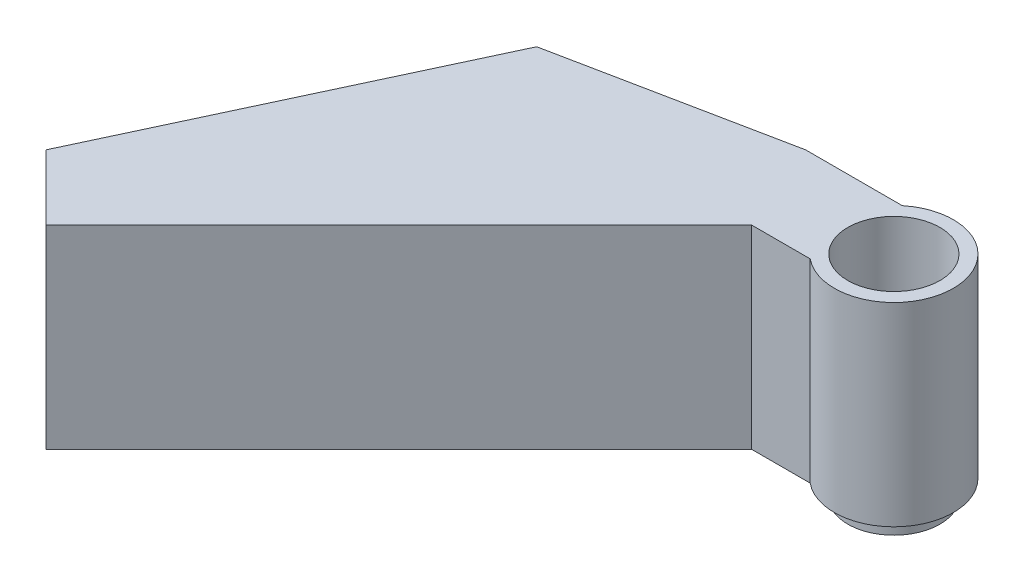
ISO-10303-21;
HEADER;
FILE_DESCRIPTION(('STEP AP214'),'2;1');
FILE_NAME('part.step','',(''),(''),'','','');
FILE_SCHEMA(('AUTOMOTIVE_DESIGN { 1 0 10303 214 1 1 1 1 }'));
ENDSEC;
DATA;
#1=APPLICATION_CONTEXT('core data for automotive mechanical design processes');
#2=APPLICATION_PROTOCOL_DEFINITION('international standard','automotive_design',2000,#1);
#3=PRODUCT_CONTEXT('',#1,'mechanical');
#4=PRODUCT('Part','Part','',(#3));
#5=PRODUCT_RELATED_PRODUCT_CATEGORY('part','',(#4));
#6=PRODUCT_DEFINITION_FORMATION('','',#4);
#7=PRODUCT_DEFINITION_CONTEXT('part definition',#1,'design');
#8=PRODUCT_DEFINITION('design','',#6,#7);
#9=PRODUCT_DEFINITION_SHAPE('','',#8);
#10=(LENGTH_UNIT() NAMED_UNIT(*) SI_UNIT(.MILLI.,.METRE.));
#11=(NAMED_UNIT(*) PLANE_ANGLE_UNIT() SI_UNIT($,.RADIAN.));
#12=(NAMED_UNIT(*) SI_UNIT($,.STERADIAN.) SOLID_ANGLE_UNIT());
#13=UNCERTAINTY_MEASURE_WITH_UNIT(LENGTH_MEASURE(1.E-05),#10,'distance_accuracy_value','');
#14=(GEOMETRIC_REPRESENTATION_CONTEXT(3) GLOBAL_UNCERTAINTY_ASSIGNED_CONTEXT((#13)) GLOBAL_UNIT_ASSIGNED_CONTEXT((#10,
#11,#12)) REPRESENTATION_CONTEXT('',''));
#15=CARTESIAN_POINT('',(0.,0.,0.));
#16=DIRECTION('',(0.,0.,1.));
#17=DIRECTION('',(1.,0.,0.));
#18=AXIS2_PLACEMENT_3D('',#15,#16,#17);
#19=CARTESIAN_POINT('',(0.,4.715,0.));
#20=DIRECTION('',(0.,-1.,0.));
#21=DIRECTION('',(0.,0.,-1.));
#22=AXIS2_PLACEMENT_3D('',#19,#20,#21);
#23=CYLINDRICAL_SURFACE('',#22,3.43);
#24=CARTESIAN_POINT('',(0.,0.,0.));
#25=DIRECTION('',(0.,1.,0.));
#26=DIRECTION('',(0.,0.,1.));
#27=AXIS2_PLACEMENT_3D('',#24,#25,#26);
#28=CIRCLE('',#27,3.43);
#29=CARTESIAN_POINT('',(0.,0.,-3.43));
#30=VERTEX_POINT('',#29);
#31=EDGE_CURVE('E58',#30,#30,#28,.T.);
#32=CARTESIAN_POINT('',(0.,1.25,0.));
#33=DIRECTION('',(0.,1.,0.));
#34=DIRECTION('',(0.,0.,1.));
#35=AXIS2_PLACEMENT_3D('',#32,#33,#34);
#36=CIRCLE('',#35,3.43);
#37=CARTESIAN_POINT('',(0.,1.25,-3.43));
#38=VERTEX_POINT('',#37);
#39=EDGE_CURVE('E182',#38,#38,#36,.F.);
#40=CARTESIAN_POINT('',(0.,0.,-3.43));
#41=CARTESIAN_POINT('',(0.,0.0130208333333333,-3.43));
#42=CARTESIAN_POINT('',(0.,0.0260416666666667,-3.43));
#43=CARTESIAN_POINT('',(0.,0.0520833333333334,-3.43));
#44=CARTESIAN_POINT('',(0.,0.0651041666666667,-3.43));
#45=CARTESIAN_POINT('',(0.,0.0911458333333334,-3.43));
#46=CARTESIAN_POINT('',(0.,0.104166666666667,-3.43));
#47=CARTESIAN_POINT('',(0.,0.130208333333333,-3.43));
#48=CARTESIAN_POINT('',(0.,0.143229166666667,-3.43));
#49=CARTESIAN_POINT('',(0.,0.169270833333333,-3.43));
#50=CARTESIAN_POINT('',(0.,0.182291666666667,-3.43));
#51=CARTESIAN_POINT('',(0.,0.208333333333334,-3.43));
#52=CARTESIAN_POINT('',(0.,0.221354166666667,-3.43));
#53=CARTESIAN_POINT('',(0.,0.247395833333334,-3.43));
#54=CARTESIAN_POINT('',(0.,0.260416666666667,-3.43));
#55=CARTESIAN_POINT('',(0.,0.286458333333334,-3.43));
#56=CARTESIAN_POINT('',(0.,0.299479166666667,-3.43));
#57=CARTESIAN_POINT('',(0.,0.325520833333333,-3.43));
#58=CARTESIAN_POINT('',(0.,0.338541666666666,-3.43));
#59=CARTESIAN_POINT('',(0.,0.364583333333333,-3.43));
#60=CARTESIAN_POINT('',(0.,0.377604166666666,-3.43));
#61=CARTESIAN_POINT('',(0.,0.403645833333333,-3.43));
#62=CARTESIAN_POINT('',(0.,0.416666666666666,-3.43));
#63=CARTESIAN_POINT('',(0.,0.442708333333333,-3.43));
#64=CARTESIAN_POINT('',(0.,0.455729166666666,-3.43));
#65=CARTESIAN_POINT('',(0.,0.481770833333333,-3.43));
#66=CARTESIAN_POINT('',(0.,0.494791666666666,-3.43));
#67=CARTESIAN_POINT('',(0.,0.520833333333333,-3.43));
#68=CARTESIAN_POINT('',(0.,0.533854166666666,-3.43));
#69=CARTESIAN_POINT('',(0.,0.559895833333333,-3.43));
#70=CARTESIAN_POINT('',(0.,0.572916666666666,-3.43));
#71=CARTESIAN_POINT('',(0.,0.598958333333333,-3.43));
#72=CARTESIAN_POINT('',(0.,0.611979166666666,-3.43));
#73=CARTESIAN_POINT('',(0.,0.638020833333333,-3.43));
#74=CARTESIAN_POINT('',(0.,0.651041666666666,-3.43));
#75=CARTESIAN_POINT('',(0.,0.677083333333333,-3.43));
#76=CARTESIAN_POINT('',(0.,0.690104166666666,-3.43));
#77=CARTESIAN_POINT('',(0.,0.716145833333333,-3.43));
#78=CARTESIAN_POINT('',(0.,0.729166666666667,-3.43));
#79=CARTESIAN_POINT('',(0.,0.755208333333333,-3.43));
#80=CARTESIAN_POINT('',(0.,0.768229166666667,-3.43));
#81=CARTESIAN_POINT('',(0.,0.794270833333333,-3.43));
#82=CARTESIAN_POINT('',(0.,0.807291666666666,-3.43));
#83=CARTESIAN_POINT('',(0.,0.833333333333333,-3.43));
#84=CARTESIAN_POINT('',(0.,0.846354166666666,-3.43));
#85=CARTESIAN_POINT('',(0.,0.872395833333332,-3.43));
#86=CARTESIAN_POINT('',(0.,0.885416666666666,-3.43));
#87=CARTESIAN_POINT('',(0.,0.911458333333332,-3.43));
#88=CARTESIAN_POINT('',(0.,0.924479166666666,-3.43));
#89=CARTESIAN_POINT('',(0.,0.950520833333332,-3.43));
#90=CARTESIAN_POINT('',(0.,0.963541666666666,-3.43));
#91=CARTESIAN_POINT('',(0.,0.989583333333333,-3.43));
#92=CARTESIAN_POINT('',(0.,1.00260416666667,-3.43));
#93=CARTESIAN_POINT('',(0.,1.02864583333333,-3.43));
#94=CARTESIAN_POINT('',(0.,1.04166666666667,-3.43));
#95=CARTESIAN_POINT('',(0.,1.06770833333333,-3.43));
#96=CARTESIAN_POINT('',(0.,1.08072916666667,-3.43));
#97=CARTESIAN_POINT('',(0.,1.10677083333333,-3.43));
#98=CARTESIAN_POINT('',(0.,1.11979166666667,-3.43));
#99=CARTESIAN_POINT('',(0.,1.14583333333333,-3.43));
#100=CARTESIAN_POINT('',(0.,1.15885416666667,-3.43));
#101=CARTESIAN_POINT('',(0.,1.18489583333333,-3.43));
#102=CARTESIAN_POINT('',(0.,1.19791666666667,-3.43));
#103=CARTESIAN_POINT('',(0.,1.22395833333333,-3.43));
#104=CARTESIAN_POINT('',(0.,1.23697916666667,-3.43));
#105=CARTESIAN_POINT('',(0.,1.25,-3.43));
#106=B_SPLINE_CURVE_WITH_KNOTS('',3,(#40,#41,#42,#43,#44,#45,#46,#47,#48,#49,#50,#51,#52,#53,
#54,#55,#56,#57,#58,#59,#60,#61,#62,#63,#64,#65,#66,#67,#68,#69,#70,#71,#72,#73,#74,#75,#76,#77,
#78,#79,#80,#81,#82,#83,#84,#85,#86,#87,#88,#89,#90,#91,#92,#93,#94,#95,#96,#97,#98,#99,#100,
#101,#102,#103,#104,#105),.UNSPECIFIED.,.F.,.F.,(4,2,2,2,2,2,2,2,2,2,2,2,2,2,2,2,2,2,2,2,2,2,2,
2,2,2,2,2,2,2,2,2,4),(0.,0.0390625,0.0781250000000001,0.1171875,0.15625,0.1953125,0.234375,
0.2734375,0.3125,0.351562499999999,0.390625,0.4296875,0.46875,0.5078125,0.546875,0.5859375,
0.625,0.6640625,0.703125,0.7421875,0.78125,0.820312499999999,0.859374999999999,
0.898437499999999,0.937499999999999,0.976562499999999,1.015625,1.0546875,1.09375,1.1328125,
1.171875,1.2109375,1.25),.UNSPECIFIED.);
#107=EDGE_CURVE('BSEAM49',#30,#38,#106,.T.);
#108=ORIENTED_EDGE('',*,*,#31,.T.);
#109=ORIENTED_EDGE('',*,*,#39,.T.);
#110=ORIENTED_EDGE('',*,*,#107,.T.);
#111=ORIENTED_EDGE('',*,*,#107,.F.);
#112=EDGE_LOOP('',(#108,#110,#109,#111));
#113=FACE_BOUND('',#112,.T.);
#114=ADVANCED_FACE('F49',(#113),#23,.T.);
#115=CARTESIAN_POINT('',(0.,4.715,0.));
#116=DIRECTION('',(0.,-1.,0.));
#117=DIRECTION('',(0.,0.,-1.));
#118=AXIS2_PLACEMENT_3D('',#115,#116,#117);
#119=CYLINDRICAL_SURFACE('',#118,1.235);
#120=CARTESIAN_POINT('',(0.,3.85,0.));
#121=DIRECTION('',(0.,1.,0.));
#122=DIRECTION('',(0.,0.,1.));
#123=AXIS2_PLACEMENT_3D('',#120,#121,#122);
#124=CIRCLE('',#123,1.235);
#125=CARTESIAN_POINT('',(0.,3.85,-1.235));
#126=VERTEX_POINT('',#125);
#127=EDGE_CURVE('E204',#126,#126,#124,.T.);
#128=CARTESIAN_POINT('',(0.,2.8,0.));
#129=DIRECTION('',(0.,-1.,0.));
#130=DIRECTION('',(0.,0.,-1.));
#131=AXIS2_PLACEMENT_3D('',#128,#129,#130);
#132=CIRCLE('',#131,1.235);
#133=CARTESIAN_POINT('',(0.,2.8,-1.235));
#134=VERTEX_POINT('',#133);
#135=EDGE_CURVE('E52',#134,#134,#132,.T.);
#136=CARTESIAN_POINT('',(0.,3.85,-1.235));
#137=CARTESIAN_POINT('',(0.,3.8390625,-1.235));
#138=CARTESIAN_POINT('',(0.,3.828125,-1.235));
#139=CARTESIAN_POINT('',(0.,3.80625,-1.235));
#140=CARTESIAN_POINT('',(0.,3.7953125,-1.235));
#141=CARTESIAN_POINT('',(0.,3.7734375,-1.235));
#142=CARTESIAN_POINT('',(0.,3.7625,-1.235));
#143=CARTESIAN_POINT('',(0.,3.740625,-1.235));
#144=CARTESIAN_POINT('',(0.,3.7296875,-1.235));
#145=CARTESIAN_POINT('',(0.,3.7078125,-1.235));
#146=CARTESIAN_POINT('',(0.,3.696875,-1.235));
#147=CARTESIAN_POINT('',(0.,3.675,-1.235));
#148=CARTESIAN_POINT('',(0.,3.6640625,-1.235));
#149=CARTESIAN_POINT('',(0.,3.6421875,-1.235));
#150=CARTESIAN_POINT('',(0.,3.63125,-1.235));
#151=CARTESIAN_POINT('',(0.,3.609375,-1.235));
#152=CARTESIAN_POINT('',(0.,3.5984375,-1.235));
#153=CARTESIAN_POINT('',(0.,3.5765625,-1.235));
#154=CARTESIAN_POINT('',(0.,3.565625,-1.235));
#155=CARTESIAN_POINT('',(0.,3.54375,-1.235));
#156=CARTESIAN_POINT('',(0.,3.5328125,-1.235));
#157=CARTESIAN_POINT('',(0.,3.5109375,-1.235));
#158=CARTESIAN_POINT('',(0.,3.5,-1.235));
#159=CARTESIAN_POINT('',(0.,3.478125,-1.235));
#160=CARTESIAN_POINT('',(0.,3.4671875,-1.235));
#161=CARTESIAN_POINT('',(0.,3.4453125,-1.235));
#162=CARTESIAN_POINT('',(0.,3.434375,-1.235));
#163=CARTESIAN_POINT('',(0.,3.4125,-1.235));
#164=CARTESIAN_POINT('',(0.,3.4015625,-1.235));
#165=CARTESIAN_POINT('',(0.,3.3796875,-1.235));
#166=CARTESIAN_POINT('',(0.,3.36875,-1.235));
#167=CARTESIAN_POINT('',(0.,3.346875,-1.235));
#168=CARTESIAN_POINT('',(0.,3.3359375,-1.235));
#169=CARTESIAN_POINT('',(0.,3.3140625,-1.235));
#170=CARTESIAN_POINT('',(0.,3.303125,-1.235));
#171=CARTESIAN_POINT('',(0.,3.28125,-1.235));
#172=CARTESIAN_POINT('',(0.,3.2703125,-1.235));
#173=CARTESIAN_POINT('',(0.,3.2484375,-1.235));
#174=CARTESIAN_POINT('',(0.,3.2375,-1.235));
#175=CARTESIAN_POINT('',(0.,3.215625,-1.235));
#176=CARTESIAN_POINT('',(0.,3.2046875,-1.235));
#177=CARTESIAN_POINT('',(0.,3.1828125,-1.235));
#178=CARTESIAN_POINT('',(0.,3.171875,-1.235));
#179=CARTESIAN_POINT('',(0.,3.15,-1.235));
#180=CARTESIAN_POINT('',(0.,3.1390625,-1.235));
#181=CARTESIAN_POINT('',(0.,3.1171875,-1.235));
#182=CARTESIAN_POINT('',(0.,3.10625,-1.235));
#183=CARTESIAN_POINT('',(0.,3.084375,-1.235));
#184=CARTESIAN_POINT('',(0.,3.0734375,-1.235));
#185=CARTESIAN_POINT('',(0.,3.0515625,-1.235));
#186=CARTESIAN_POINT('',(0.,3.040625,-1.235));
#187=CARTESIAN_POINT('',(0.,3.01875,-1.235));
#188=CARTESIAN_POINT('',(0.,3.0078125,-1.235));
#189=CARTESIAN_POINT('',(0.,2.9859375,-1.235));
#190=CARTESIAN_POINT('',(0.,2.975,-1.235));
#191=CARTESIAN_POINT('',(0.,2.953125,-1.235));
#192=CARTESIAN_POINT('',(0.,2.9421875,-1.235));
#193=CARTESIAN_POINT('',(0.,2.9203125,-1.235));
#194=CARTESIAN_POINT('',(0.,2.909375,-1.235));
#195=CARTESIAN_POINT('',(0.,2.8875,-1.235));
#196=CARTESIAN_POINT('',(0.,2.8765625,-1.235));
#197=CARTESIAN_POINT('',(0.,2.8546875,-1.235));
#198=CARTESIAN_POINT('',(0.,2.84375,-1.235));
#199=CARTESIAN_POINT('',(0.,2.821875,-1.235));
#200=CARTESIAN_POINT('',(0.,2.8109375,-1.235));
#201=CARTESIAN_POINT('',(0.,2.8,-1.235));
#202=B_SPLINE_CURVE_WITH_KNOTS('',3,(#136,#137,#138,#139,#140,#141,#142,#143,#144,#145,#146,
#147,#148,#149,#150,#151,#152,#153,#154,#155,#156,#157,#158,#159,#160,#161,#162,#163,#164,#165,
#166,#167,#168,#169,#170,#171,#172,#173,#174,#175,#176,#177,#178,#179,#180,#181,#182,#183,#184,
#185,#186,#187,#188,#189,#190,#191,#192,#193,#194,#195,#196,#197,#198,#199,#200,#201),
.UNSPECIFIED.,.F.,.F.,(4,2,2,2,2,2,2,2,2,2,2,2,2,2,2,2,2,2,2,2,2,2,2,2,2,2,2,2,2,2,2,2,4),(0.,
0.0328125000000003,0.0656250000000001,0.0984375,0.13125,0.1640625,0.196875,0.2296875,0.2625,
0.2953125,0.328125,0.3609375,0.39375,0.4265625,0.459375,0.4921875,0.525,0.5578125,0.590625,
0.623437499999999,0.65625,0.6890625,0.721875,0.7546875,0.7875,0.820312499999999,
0.853124999999999,0.8859375,0.91875,0.9515625,0.984375,1.0171875,1.05),.UNSPECIFIED.);
#203=EDGE_CURVE('BSEAM214',#126,#134,#202,.T.);
#204=ORIENTED_EDGE('',*,*,#127,.T.);
#205=ORIENTED_EDGE('',*,*,#135,.T.);
#206=ORIENTED_EDGE('',*,*,#203,.T.);
#207=ORIENTED_EDGE('',*,*,#203,.F.);
#208=EDGE_LOOP('',(#204,#206,#205,#207));
#209=FACE_BOUND('',#208,.T.);
#210=ADVANCED_FACE('F214',(#209),#119,.F.);
#211=CARTESIAN_POINT('',(0.,4.715,0.));
#212=DIRECTION('',(0.,1.,0.));
#213=DIRECTION('',(0.,0.,1.));
#214=AXIS2_PLACEMENT_3D('',#211,#212,#213);
#215=PLANE('',#214);
#216=CARTESIAN_POINT('',(0.,4.715,0.));
#217=DIRECTION('',(0.,1.,0.));
#218=DIRECTION('',(0.,0.,1.));
#219=AXIS2_PLACEMENT_3D('',#216,#217,#218);
#220=CIRCLE('',#219,2.45);
#221=CARTESIAN_POINT('',(0.,4.715,2.45));
#222=VERTEX_POINT('',#221);
#223=EDGE_CURVE('E191',#222,#222,#220,.T.);
#224=ORIENTED_EDGE('',*,*,#223,.F.);
#225=EDGE_LOOP('',(#224));
#226=FACE_BOUND('',#225,.T.);
#227=CARTESIAN_POINT('',(0.,4.715,0.));
#228=DIRECTION('',(0.,1.,0.));
#229=DIRECTION('',(0.,0.,1.));
#230=AXIS2_PLACEMENT_3D('',#227,#228,#229);
#231=CIRCLE('',#230,3.43);
#232=CARTESIAN_POINT('',(0.,4.715,3.43));
#233=VERTEX_POINT('',#232);
#234=EDGE_CURVE('E12',#233,#233,#231,.T.);
#235=ORIENTED_EDGE('',*,*,#234,.T.);
#236=EDGE_LOOP('',(#235));
#237=FACE_BOUND('',#236,.T.);
#238=ADVANCED_FACE('F231',(#226,#237),#215,.T.);
#239=CARTESIAN_POINT('',(0.,0.,0.));
#240=DIRECTION('',(0.,1.,0.));
#241=DIRECTION('',(0.,0.,1.));
#242=AXIS2_PLACEMENT_3D('',#239,#240,#241);
#243=PLANE('',#242);
#244=CARTESIAN_POINT('',(0.,0.,0.));
#245=DIRECTION('',(0.,-1.,0.));
#246=DIRECTION('',(0.,0.,-1.));
#247=AXIS2_PLACEMENT_3D('',#244,#245,#246);
#248=CIRCLE('',#247,2.5);
#249=CARTESIAN_POINT('',(0.,0.,-2.5));
#250=VERTEX_POINT('',#249);
#251=EDGE_CURVE('E171',#250,#250,#248,.T.);
#252=ORIENTED_EDGE('',*,*,#251,.F.);
#253=EDGE_LOOP('',(#252));
#254=FACE_BOUND('',#253,.T.);
#255=ORIENTED_EDGE('',*,*,#31,.F.);
#256=EDGE_LOOP('',(#255));
#257=FACE_BOUND('',#256,.T.);
#258=ADVANCED_FACE('F227',(#254,#257),#243,.F.);
#259=CARTESIAN_POINT('',(0.,3.85,0.));
#260=DIRECTION('',(0.,1.,0.));
#261=DIRECTION('',(0.,0.,1.));
#262=AXIS2_PLACEMENT_3D('',#259,#260,#261);
#263=CYLINDRICAL_SURFACE('',#262,2.45);
#264=CARTESIAN_POINT('',(0.,3.85,0.));
#265=DIRECTION('',(0.,1.,0.));
#266=DIRECTION('',(0.,0.,1.));
#267=AXIS2_PLACEMENT_3D('',#264,#265,#266);
#268=CIRCLE('',#267,2.45);
#269=CARTESIAN_POINT('',(0.,3.85,2.45));
#270=VERTEX_POINT('',#269);
#271=EDGE_CURVE('E200',#270,#270,#268,.T.);
#272=ORIENTED_EDGE('',*,*,#271,.F.);
#273=EDGE_LOOP('',(#272));
#274=FACE_BOUND('',#273,.T.);
#275=ORIENTED_EDGE('',*,*,#223,.T.);
#276=EDGE_LOOP('',(#275));
#277=FACE_BOUND('',#276,.T.);
#278=ADVANCED_FACE('F221',(#274,#277),#263,.F.);
#279=CARTESIAN_POINT('',(0.,3.85,0.));
#280=DIRECTION('',(0.,1.,0.));
#281=DIRECTION('',(0.,0.,1.));
#282=AXIS2_PLACEMENT_3D('',#279,#280,#281);
#283=PLANE('',#282);
#284=ORIENTED_EDGE('',*,*,#127,.F.);
#285=EDGE_LOOP('',(#284));
#286=FACE_BOUND('',#285,.T.);
#287=ORIENTED_EDGE('',*,*,#271,.T.);
#288=EDGE_LOOP('',(#287));
#289=FACE_BOUND('',#288,.T.);
#290=ADVANCED_FACE('F217',(#286,#289),#283,.T.);
#291=CARTESIAN_POINT('',(0.,-12.1268132664769,-3.43));
#292=DIRECTION('',(0.,0.,-1.));
#293=DIRECTION('',(-1.,0.,0.));
#294=AXIS2_PLACEMENT_3D('',#291,#292,#293);
#295=PLANE('',#294);
#296=DIRECTION('',(0.,1.,0.));
#297=VECTOR('',#296,1.);
#298=CARTESIAN_POINT('',(-2.80356915377524,-10.1878373262802,-3.43));
#299=LINE('',#298,#297);
#300=CARTESIAN_POINT('',(-2.80356915377524,1.25,-3.43));
#301=VERTEX_POINT('',#300);
#302=CARTESIAN_POINT('',(-2.80356915377524,15.715,-3.43));
#303=VERTEX_POINT('',#302);
#304=EDGE_CURVE('E143',#301,#303,#299,.T.);
#305=ORIENTED_EDGE('',*,*,#304,.F.);
#306=DIRECTION('',(1.,0.,0.));
#307=VECTOR('',#306,1.);
#308=CARTESIAN_POINT('',(0.,1.25,-3.43));
#309=LINE('',#308,#307);
#310=CARTESIAN_POINT('',(-10.,1.25,-3.43));
#311=VERTEX_POINT('',#310);
#312=EDGE_CURVE('E187',#311,#301,#309,.T.);
#313=ORIENTED_EDGE('',*,*,#312,.F.);
#314=DIRECTION('',(0.,-1.,0.));
#315=VECTOR('',#314,1.);
#316=CARTESIAN_POINT('',(-10.,15.715,-3.43));
#317=LINE('',#316,#315);
#318=CARTESIAN_POINT('',(-10.,15.715,-3.43));
#319=VERTEX_POINT('',#318);
#320=EDGE_CURVE('E168',#319,#311,#317,.T.);
#321=ORIENTED_EDGE('',*,*,#320,.F.);
#322=DIRECTION('',(-1.,0.,0.));
#323=VECTOR('',#322,1.);
#324=CARTESIAN_POINT('',(0.,15.715,-3.43));
#325=LINE('',#324,#323);
#326=EDGE_CURVE('E66',#303,#319,#325,.T.);
#327=ORIENTED_EDGE('',*,*,#326,.F.);
#328=EDGE_LOOP('',(#305,#313,#321,#327));
#329=FACE_BOUND('',#328,.T.);
#330=ADVANCED_FACE('F220',(#329),#295,.T.);
#331=CARTESIAN_POINT('',(0.,-12.1268132664769,0.));
#332=DIRECTION('',(0.,1.,0.));
#333=DIRECTION('',(0.,0.,1.));
#334=AXIS2_PLACEMENT_3D('',#331,#332,#333);
#335=CYLINDRICAL_SURFACE('',#334,3.43);
#336=CARTESIAN_POINT('',(0.,15.715,0.));
#337=DIRECTION('',(0.,1.,0.));
#338=DIRECTION('',(0.,0.,1.));
#339=AXIS2_PLACEMENT_3D('',#336,#337,#338);
#340=CIRCLE('',#339,3.43);
#341=CARTESIAN_POINT('',(0.,15.715,3.43));
#342=VERTEX_POINT('',#341);
#343=EDGE_CURVE('E183',#342,#342,#340,.T.);
#344=CARTESIAN_POINT('',(0.,15.715,3.43));
#345=CARTESIAN_POINT('',(0.,15.6004166666667,3.43));
#346=CARTESIAN_POINT('',(0.,15.4858333333333,3.43));
#347=CARTESIAN_POINT('',(0.,15.2566666666667,3.43));
#348=CARTESIAN_POINT('',(0.,15.1420833333333,3.43));
#349=CARTESIAN_POINT('',(0.,14.9129166666667,3.43));
#350=CARTESIAN_POINT('',(0.,14.7983333333333,3.43));
#351=CARTESIAN_POINT('',(0.,14.5691666666667,3.43));
#352=CARTESIAN_POINT('',(0.,14.4545833333333,3.43));
#353=CARTESIAN_POINT('',(0.,14.2254166666667,3.43));
#354=CARTESIAN_POINT('',(0.,14.1108333333333,3.43));
#355=CARTESIAN_POINT('',(0.,13.8816666666667,3.43));
#356=CARTESIAN_POINT('',(0.,13.7670833333333,3.43));
#357=CARTESIAN_POINT('',(0.,13.5379166666667,3.43));
#358=CARTESIAN_POINT('',(0.,13.4233333333333,3.43));
#359=CARTESIAN_POINT('',(0.,13.1941666666667,3.43));
#360=CARTESIAN_POINT('',(0.,13.0795833333333,3.43));
#361=CARTESIAN_POINT('',(0.,12.8504166666667,3.43));
#362=CARTESIAN_POINT('',(0.,12.7358333333333,3.43));
#363=CARTESIAN_POINT('',(0.,12.5066666666667,3.43));
#364=CARTESIAN_POINT('',(0.,12.3920833333333,3.43));
#365=CARTESIAN_POINT('',(0.,12.1629166666667,3.43));
#366=CARTESIAN_POINT('',(0.,12.0483333333333,3.43));
#367=CARTESIAN_POINT('',(0.,11.8191666666667,3.43));
#368=CARTESIAN_POINT('',(0.,11.7045833333333,3.43));
#369=CARTESIAN_POINT('',(0.,11.4754166666667,3.43));
#370=CARTESIAN_POINT('',(0.,11.3608333333333,3.43));
#371=CARTESIAN_POINT('',(0.,11.1316666666667,3.43));
#372=CARTESIAN_POINT('',(0.,11.0170833333333,3.43));
#373=CARTESIAN_POINT('',(0.,10.7879166666667,3.43));
#374=CARTESIAN_POINT('',(0.,10.6733333333333,3.43));
#375=CARTESIAN_POINT('',(0.,10.4441666666667,3.43));
#376=CARTESIAN_POINT('',(0.,10.3295833333333,3.43));
#377=CARTESIAN_POINT('',(0.,10.1004166666667,3.43));
#378=CARTESIAN_POINT('',(0.,9.98583333333333,3.43));
#379=CARTESIAN_POINT('',(0.,9.75666666666667,3.43));
#380=CARTESIAN_POINT('',(0.,9.64208333333333,3.43));
#381=CARTESIAN_POINT('',(0.,9.41291666666666,3.43));
#382=CARTESIAN_POINT('',(0.,9.29833333333333,3.43));
#383=CARTESIAN_POINT('',(0.,9.06916666666667,3.43));
#384=CARTESIAN_POINT('',(0.,8.95458333333333,3.43));
#385=CARTESIAN_POINT('',(0.,8.72541666666666,3.43));
#386=CARTESIAN_POINT('',(0.,8.61083333333333,3.43));
#387=CARTESIAN_POINT('',(0.,8.38166666666667,3.43));
#388=CARTESIAN_POINT('',(0.,8.26708333333333,3.43));
#389=CARTESIAN_POINT('',(0.,8.03791666666667,3.43));
#390=CARTESIAN_POINT('',(0.,7.92333333333333,3.43));
#391=CARTESIAN_POINT('',(0.,7.69416666666667,3.43));
#392=CARTESIAN_POINT('',(0.,7.57958333333333,3.43));
#393=CARTESIAN_POINT('',(0.,7.35041666666667,3.43));
#394=CARTESIAN_POINT('',(0.,7.23583333333333,3.43));
#395=CARTESIAN_POINT('',(0.,7.00666666666667,3.43));
#396=CARTESIAN_POINT('',(0.,6.89208333333333,3.43));
#397=CARTESIAN_POINT('',(0.,6.66291666666667,3.43));
#398=CARTESIAN_POINT('',(0.,6.54833333333333,3.43));
#399=CARTESIAN_POINT('',(0.,6.31916666666667,3.43));
#400=CARTESIAN_POINT('',(0.,6.20458333333333,3.43));
#401=CARTESIAN_POINT('',(0.,5.97541666666667,3.43));
#402=CARTESIAN_POINT('',(0.,5.86083333333333,3.43));
#403=CARTESIAN_POINT('',(0.,5.63166666666667,3.43));
#404=CARTESIAN_POINT('',(0.,5.51708333333333,3.43));
#405=CARTESIAN_POINT('',(0.,5.28791666666667,3.43));
#406=CARTESIAN_POINT('',(0.,5.17333333333333,3.43));
#407=CARTESIAN_POINT('',(0.,4.94416666666667,3.43));
#408=CARTESIAN_POINT('',(0.,4.82958333333333,3.43));
#409=CARTESIAN_POINT('',(0.,4.715,3.43));
#410=B_SPLINE_CURVE_WITH_KNOTS('',3,(#344,#345,#346,#347,#348,#349,#350,#351,#352,#353,#354,
#355,#356,#357,#358,#359,#360,#361,#362,#363,#364,#365,#366,#367,#368,#369,#370,#371,#372,#373,
#374,#375,#376,#377,#378,#379,#380,#381,#382,#383,#384,#385,#386,#387,#388,#389,#390,#391,#392,
#393,#394,#395,#396,#397,#398,#399,#400,#401,#402,#403,#404,#405,#406,#407,#408,#409),
.UNSPECIFIED.,.F.,.F.,(4,2,2,2,2,2,2,2,2,2,2,2,2,2,2,2,2,2,2,2,2,2,2,2,2,2,2,2,2,2,2,2,4),(0.,
0.34375,0.687500000000001,1.03125,1.375,1.71875,2.0625,2.40625,2.75,3.09375,3.4375,3.78125,
4.125,4.46875,4.8125,5.15625,5.5,5.84375,6.1875,6.53125,6.875,7.21875,7.5625,7.90625,8.25,
8.59375,8.9375,9.28125,9.62499999999999,9.96875,10.3125,10.65625,11.),.UNSPECIFIED.);
#411=EDGE_CURVE('BSEAM237',#342,#233,#410,.T.);
#412=ORIENTED_EDGE('',*,*,#343,.T.);
#413=ORIENTED_EDGE('',*,*,#234,.F.);
#414=ORIENTED_EDGE('',*,*,#411,.T.);
#415=ORIENTED_EDGE('',*,*,#411,.F.);
#416=EDGE_LOOP('',(#412,#414,#413,#415));
#417=FACE_BOUND('',#416,.T.);
#418=ADVANCED_FACE('F237',(#417),#335,.F.);
#419=CARTESIAN_POINT('',(0.,-12.1268132664769,3.43));
#420=DIRECTION('',(0.,0.,-1.));
#421=DIRECTION('',(-1.,0.,0.));
#422=AXIS2_PLACEMENT_3D('',#419,#420,#421);
#423=PLANE('',#422);
#424=DIRECTION('',(1.,0.,0.));
#425=VECTOR('',#424,1.);
#426=CARTESIAN_POINT('',(0.,1.25,3.43));
#427=LINE('',#426,#425);
#428=CARTESIAN_POINT('',(-7.15849496212056,1.25,3.43));
#429=VERTEX_POINT('',#428);
#430=CARTESIAN_POINT('',(-2.80356915377524,1.25,3.43));
#431=VERTEX_POINT('',#430);
#432=EDGE_CURVE('E179',#429,#431,#427,.T.);
#433=ORIENTED_EDGE('',*,*,#432,.T.);
#434=DIRECTION('',(0.,1.,0.));
#435=VECTOR('',#434,1.);
#436=CARTESIAN_POINT('',(-2.80356915377524,-10.1878373262802,3.43));
#437=LINE('',#436,#435);
#438=CARTESIAN_POINT('',(-2.80356915377524,15.715,3.43));
#439=VERTEX_POINT('',#438);
#440=EDGE_CURVE('E74',#431,#439,#437,.T.);
#441=ORIENTED_EDGE('',*,*,#440,.T.);
#442=DIRECTION('',(-1.,0.,0.));
#443=VECTOR('',#442,1.);
#444=CARTESIAN_POINT('',(0.,15.715,3.43));
#445=LINE('',#444,#443);
#446=CARTESIAN_POINT('',(-7.15849496212056,15.715,3.43));
#447=VERTEX_POINT('',#446);
#448=EDGE_CURVE('E194',#439,#447,#445,.T.);
#449=ORIENTED_EDGE('',*,*,#448,.T.);
#450=DIRECTION('',(0.,-1.,0.));
#451=VECTOR('',#450,1.);
#452=CARTESIAN_POINT('',(-7.15849496212056,-12.1268132664769,3.43));
#453=LINE('',#452,#451);
#454=EDGE_CURVE('E155',#447,#429,#453,.T.);
#455=ORIENTED_EDGE('',*,*,#454,.T.);
#456=EDGE_LOOP('',(#433,#441,#449,#455));
#457=FACE_BOUND('',#456,.T.);
#458=ADVANCED_FACE('F239',(#457),#423,.F.);
#459=CARTESIAN_POINT('',(0.,15.715,0.));
#460=DIRECTION('',(0.,1.,0.));
#461=DIRECTION('',(0.,0.,1.));
#462=AXIS2_PLACEMENT_3D('',#459,#460,#461);
#463=PLANE('',#462);
#464=DIRECTION('',(0.980224350285927,0.,-0.197889421411385));
#465=VECTOR('',#464,1.);
#466=CARTESIAN_POINT('',(-10.,15.715,-3.43));
#467=LINE('',#466,#465);
#468=CARTESIAN_POINT('',(-26.6638139548608,15.715,-0.0658798360064555));
#469=VERTEX_POINT('',#468);
#470=EDGE_CURVE('E113',#469,#319,#467,.T.);
#471=ORIENTED_EDGE('',*,*,#470,.F.);
#472=DIRECTION('',(-0.422618261740705,0.,0.906307787036647));
#473=VECTOR('',#472,1.);
#474=CARTESIAN_POINT('',(-38.2842712474618,15.715,24.854271247462));
#475=LINE('',#474,#473);
#476=CARTESIAN_POINT('',(-38.2842712474618,15.715,24.854271247462));
#477=VERTEX_POINT('',#476);
#478=EDGE_CURVE('E125',#469,#477,#475,.T.);
#479=ORIENTED_EDGE('',*,*,#478,.T.);
#480=DIRECTION('',(0.70710678118655,0.,0.707106781186546));
#481=VECTOR('',#480,1.);
#482=CARTESIAN_POINT('',(-38.2842712474618,15.715,24.854271247462));
#483=LINE('',#482,#481);
#484=CARTESIAN_POINT('',(-33.4335187285221,15.715,29.7050237664017));
#485=VERTEX_POINT('',#484);
#486=EDGE_CURVE('E140',#477,#485,#483,.T.);
#487=ORIENTED_EDGE('',*,*,#486,.T.);
#488=DIRECTION('',(0.707106781186546,0.,-0.707106781186549));
#489=VECTOR('',#488,1.);
#490=CARTESIAN_POINT('',(-33.4335187285221,15.715,29.7050237664017));
#491=LINE('',#490,#489);
#492=EDGE_CURVE('E158',#485,#447,#491,.T.);
#493=ORIENTED_EDGE('',*,*,#492,.T.);
#494=ORIENTED_EDGE('',*,*,#448,.F.);
#495=CARTESIAN_POINT('',(0.,15.715,0.));
#496=DIRECTION('',(0.,1.,0.));
#497=DIRECTION('',(0.,0.,1.));
#498=AXIS2_PLACEMENT_3D('',#495,#496,#497);
#499=CIRCLE('',#498,4.43);
#500=EDGE_CURVE('E441',#439,#303,#499,.T.);
#501=ORIENTED_EDGE('',*,*,#500,.T.);
#502=ORIENTED_EDGE('',*,*,#326,.T.);
#503=EDGE_LOOP('',(#471,#479,#487,#493,#494,#501,#502));
#504=FACE_BOUND('',#503,.T.);
#505=ORIENTED_EDGE('',*,*,#343,.F.);
#506=EDGE_LOOP('',(#505));
#507=FACE_BOUND('',#506,.T.);
#508=ADVANCED_FACE('F122',(#504,#507),#463,.T.);
#509=CARTESIAN_POINT('',(0.,1.25,0.));
#510=DIRECTION('',(0.,1.,0.));
#511=DIRECTION('',(0.,0.,1.));
#512=AXIS2_PLACEMENT_3D('',#509,#510,#511);
#513=PLANE('',#512);
#514=DIRECTION('',(0.422618261740705,0.,-0.906307787036647));
#515=VECTOR('',#514,1.);
#516=CARTESIAN_POINT('',(-38.2842712474618,1.25,24.854271247462));
#517=LINE('',#516,#515);
#518=CARTESIAN_POINT('',(-38.2842712474618,1.25,24.854271247462));
#519=VERTEX_POINT('',#518);
#520=CARTESIAN_POINT('',(-26.6638139548608,1.25,-0.0658798360064555));
#521=VERTEX_POINT('',#520);
#522=EDGE_CURVE('E135',#519,#521,#517,.T.);
#523=ORIENTED_EDGE('',*,*,#522,.T.);
#524=DIRECTION('',(0.980224350285927,0.,-0.197889421411385));
#525=VECTOR('',#524,1.);
#526=CARTESIAN_POINT('',(-1.05694001235814,1.25,-5.23544073005892));
#527=LINE('',#526,#525);
#528=EDGE_CURVE('E115',#521,#311,#527,.T.);
#529=ORIENTED_EDGE('',*,*,#528,.T.);
#530=ORIENTED_EDGE('',*,*,#312,.T.);
#531=CARTESIAN_POINT('',(0.,1.25,0.));
#532=DIRECTION('',(0.,1.,0.));
#533=DIRECTION('',(0.,0.,1.));
#534=AXIS2_PLACEMENT_3D('',#531,#532,#533);
#535=CIRCLE('',#534,4.43);
#536=EDGE_CURVE('E136',#301,#431,#535,.F.);
#537=ORIENTED_EDGE('',*,*,#536,.T.);
#538=ORIENTED_EDGE('',*,*,#432,.F.);
#539=DIRECTION('',(-0.707106781186546,0.,0.707106781186549));
#540=VECTOR('',#539,1.);
#541=CARTESIAN_POINT('',(-33.4335187285221,1.25,29.7050237664017));
#542=LINE('',#541,#540);
#543=CARTESIAN_POINT('',(-33.4335187285221,1.25,29.7050237664017));
#544=VERTEX_POINT('',#543);
#545=EDGE_CURVE('E151',#429,#544,#542,.T.);
#546=ORIENTED_EDGE('',*,*,#545,.T.);
#547=DIRECTION('',(-0.70710678118655,0.,-0.707106781186545));
#548=VECTOR('',#547,1.);
#549=CARTESIAN_POINT('',(-38.2842712474618,1.25,24.854271247462));
#550=LINE('',#549,#548);
#551=EDGE_CURVE('E147',#544,#519,#550,.T.);
#552=ORIENTED_EDGE('',*,*,#551,.T.);
#553=EDGE_LOOP('',(#523,#529,#530,#537,#538,#546,#552));
#554=FACE_BOUND('',#553,.T.);
#555=ORIENTED_EDGE('',*,*,#39,.F.);
#556=EDGE_LOOP('',(#555));
#557=FACE_BOUND('',#556,.T.);
#558=ADVANCED_FACE('F260',(#554,#557),#513,.F.);
#559=CARTESIAN_POINT('',(0.,2.8,0.));
#560=DIRECTION('',(0.,-1.,0.));
#561=DIRECTION('',(0.,0.,-1.));
#562=AXIS2_PLACEMENT_3D('',#559,#560,#561);
#563=CYLINDRICAL_SURFACE('',#562,2.5);
#564=CARTESIAN_POINT('',(0.,2.8,0.));
#565=DIRECTION('',(0.,-1.,0.));
#566=DIRECTION('',(0.,0.,-1.));
#567=AXIS2_PLACEMENT_3D('',#564,#565,#566);
#568=CIRCLE('',#567,2.5);
#569=CARTESIAN_POINT('',(0.,2.8,-2.5));
#570=VERTEX_POINT('',#569);
#571=EDGE_CURVE('E172',#570,#570,#568,.T.);
#572=ORIENTED_EDGE('',*,*,#571,.F.);
#573=EDGE_LOOP('',(#572));
#574=FACE_BOUND('',#573,.T.);
#575=ORIENTED_EDGE('',*,*,#251,.T.);
#576=EDGE_LOOP('',(#575));
#577=FACE_BOUND('',#576,.T.);
#578=ADVANCED_FACE('F262',(#574,#577),#563,.F.);
#579=CARTESIAN_POINT('',(0.,2.8,0.));
#580=DIRECTION('',(0.,-1.,0.));
#581=DIRECTION('',(0.,0.,-1.));
#582=AXIS2_PLACEMENT_3D('',#579,#580,#581);
#583=PLANE('',#582);
#584=ORIENTED_EDGE('',*,*,#135,.F.);
#585=EDGE_LOOP('',(#584));
#586=FACE_BOUND('',#585,.T.);
#587=ORIENTED_EDGE('',*,*,#571,.T.);
#588=EDGE_LOOP('',(#587));
#589=FACE_BOUND('',#588,.T.);
#590=ADVANCED_FACE('F270',(#586,#589),#583,.T.);
#591=CARTESIAN_POINT('',(-33.4335187285221,-45.61,29.7050237664017));
#592=DIRECTION('',(0.707106781186549,0.,0.707106781186546));
#593=DIRECTION('',(0.707106781186546,0.,-0.707106781186549));
#594=AXIS2_PLACEMENT_3D('',#591,#592,#593);
#595=PLANE('',#594);
#596=ORIENTED_EDGE('',*,*,#454,.F.);
#597=ORIENTED_EDGE('',*,*,#492,.F.);
#598=DIRECTION('',(0.,1.,0.));
#599=VECTOR('',#598,1.);
#600=CARTESIAN_POINT('',(-33.4335187285221,-45.61,29.7050237664017));
#601=LINE('',#600,#599);
#602=EDGE_CURVE('E152',#544,#485,#601,.T.);
#603=ORIENTED_EDGE('',*,*,#602,.F.);
#604=ORIENTED_EDGE('',*,*,#545,.F.);
#605=EDGE_LOOP('',(#596,#597,#603,#604));
#606=FACE_BOUND('',#605,.T.);
#607=ADVANCED_FACE('F276',(#606),#595,.T.);
#608=CARTESIAN_POINT('',(-38.2842712474618,-45.61,24.854271247462));
#609=DIRECTION('',(-0.707106781186545,0.,0.70710678118655));
#610=DIRECTION('',(0.70710678118655,0.,0.707106781186545));
#611=AXIS2_PLACEMENT_3D('',#608,#609,#610);
#612=PLANE('',#611);
#613=ORIENTED_EDGE('',*,*,#551,.F.);
#614=ORIENTED_EDGE('',*,*,#602,.T.);
#615=ORIENTED_EDGE('',*,*,#486,.F.);
#616=DIRECTION('',(0.,1.,0.));
#617=VECTOR('',#616,1.);
#618=CARTESIAN_POINT('',(-38.2842712474618,-45.61,24.854271247462));
#619=LINE('',#618,#617);
#620=EDGE_CURVE('E132',#519,#477,#619,.T.);
#621=ORIENTED_EDGE('',*,*,#620,.F.);
#622=EDGE_LOOP('',(#613,#614,#615,#621));
#623=FACE_BOUND('',#622,.T.);
#624=ADVANCED_FACE('F278',(#623),#612,.T.);
#625=CARTESIAN_POINT('',(-38.2842712474618,-46.5865115782008,24.854271247462));
#626=DIRECTION('',(-0.906307787036647,0.,-0.422618261740705));
#627=DIRECTION('',(-0.422618261740705,0.,0.906307787036647));
#628=AXIS2_PLACEMENT_3D('',#625,#626,#627);
#629=PLANE('',#628);
#630=DIRECTION('',(0.,1.,0.));
#631=VECTOR('',#630,1.);
#632=CARTESIAN_POINT('',(-26.6638139548608,0.,-0.0658798360064555));
#633=LINE('',#632,#631);
#634=EDGE_CURVE('E110',#521,#469,#633,.T.);
#635=ORIENTED_EDGE('',*,*,#634,.F.);
#636=ORIENTED_EDGE('',*,*,#522,.F.);
#637=ORIENTED_EDGE('',*,*,#620,.T.);
#638=ORIENTED_EDGE('',*,*,#478,.F.);
#639=EDGE_LOOP('',(#635,#636,#637,#638));
#640=FACE_BOUND('',#639,.T.);
#641=ADVANCED_FACE('F130',(#640),#629,.T.);
#642=CARTESIAN_POINT('',(0.,-10.1878373262802,0.));
#643=DIRECTION('',(0.,1.,0.));
#644=DIRECTION('',(0.,0.,1.));
#645=AXIS2_PLACEMENT_3D('',#642,#643,#644);
#646=CYLINDRICAL_SURFACE('',#645,4.43);
#647=ORIENTED_EDGE('',*,*,#536,.F.);
#648=ORIENTED_EDGE('',*,*,#304,.T.);
#649=ORIENTED_EDGE('',*,*,#500,.F.);
#650=ORIENTED_EDGE('',*,*,#440,.F.);
#651=EDGE_LOOP('',(#647,#648,#649,#650));
#652=FACE_BOUND('',#651,.T.);
#653=ADVANCED_FACE('F285',(#652),#646,.T.);
#654=CARTESIAN_POINT('',(-10.,0.,-3.43));
#655=DIRECTION('',(0.197889421411385,0.,0.980224350285927));
#656=DIRECTION('',(0.980224350285927,0.,-0.197889421411385));
#657=AXIS2_PLACEMENT_3D('',#654,#655,#656);
#658=PLANE('',#657);
#659=ORIENTED_EDGE('',*,*,#634,.T.);
#660=ORIENTED_EDGE('',*,*,#470,.T.);
#661=ORIENTED_EDGE('',*,*,#320,.T.);
#662=ORIENTED_EDGE('',*,*,#528,.F.);
#663=EDGE_LOOP('',(#659,#660,#661,#662));
#664=FACE_BOUND('',#663,.T.);
#665=ADVANCED_FACE('F112',(#664),#658,.F.);
#666=CLOSED_SHELL('',(#114,#210,#238,#258,#278,#290,#330,#418,#458,#508,#558,#578,#590,#607,
#624,#641,#653,#665));
#667=MANIFOLD_SOLID_BREP('B2',#666);
#668=ADVANCED_BREP_SHAPE_REPRESENTATION('',(#18,#667),#14);
#669=SHAPE_DEFINITION_REPRESENTATION(#9,#668);
ENDSEC;
END-ISO-10303-21;
